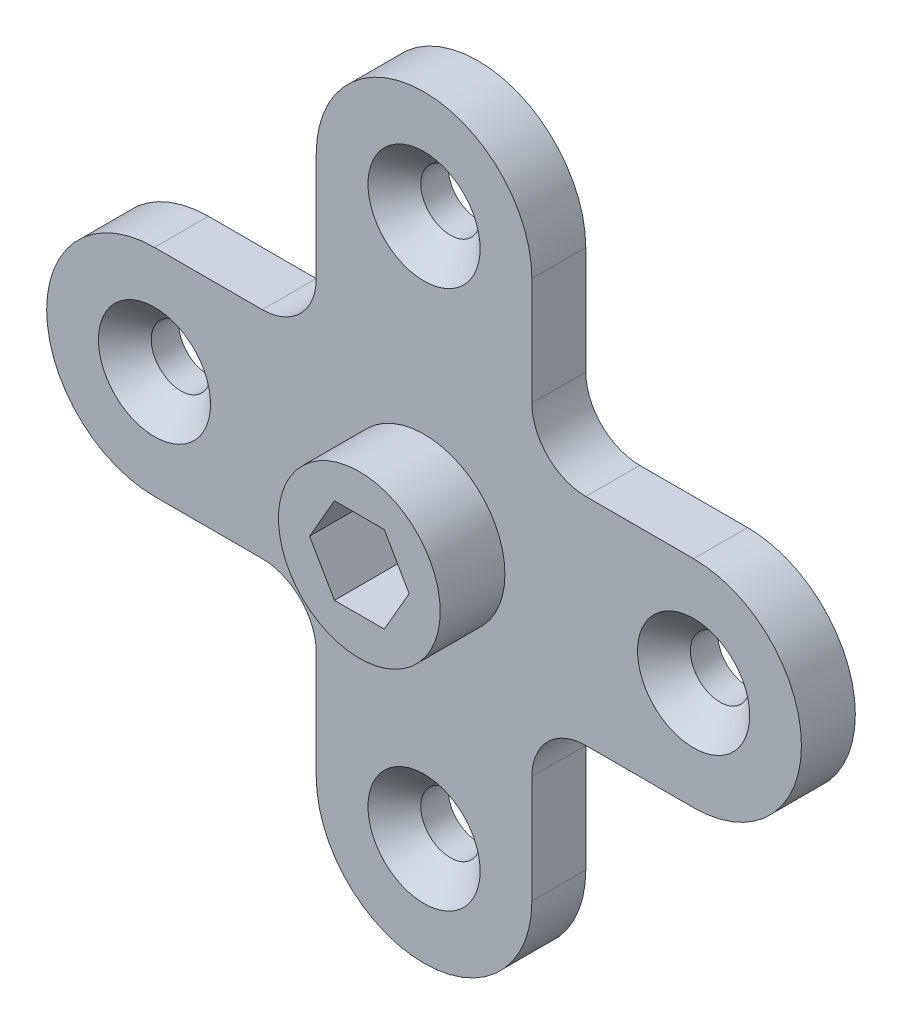
ISO-10303-21;
HEADER;
FILE_DESCRIPTION(('STEP AP214'),'2;1');
FILE_NAME('part.step','',(''),(''),'','','');
FILE_SCHEMA(('AUTOMOTIVE_DESIGN { 1 0 10303 214 1 1 1 1 }'));
ENDSEC;
DATA;
#1=APPLICATION_CONTEXT('core data for automotive mechanical design processes');
#2=APPLICATION_PROTOCOL_DEFINITION('international standard','automotive_design',2000,#1);
#3=PRODUCT_CONTEXT('',#1,'mechanical');
#4=PRODUCT('Part','Part','',(#3));
#5=PRODUCT_RELATED_PRODUCT_CATEGORY('part','',(#4));
#6=PRODUCT_DEFINITION_FORMATION('','',#4);
#7=PRODUCT_DEFINITION_CONTEXT('part definition',#1,'design');
#8=PRODUCT_DEFINITION('design','',#6,#7);
#9=PRODUCT_DEFINITION_SHAPE('','',#8);
#10=(LENGTH_UNIT() NAMED_UNIT(*) SI_UNIT(.MILLI.,.METRE.));
#11=(NAMED_UNIT(*) PLANE_ANGLE_UNIT() SI_UNIT($,.RADIAN.));
#12=(NAMED_UNIT(*) SI_UNIT($,.STERADIAN.) SOLID_ANGLE_UNIT());
#13=UNCERTAINTY_MEASURE_WITH_UNIT(LENGTH_MEASURE(1.E-05),#10,'distance_accuracy_value','');
#14=(GEOMETRIC_REPRESENTATION_CONTEXT(3) GLOBAL_UNCERTAINTY_ASSIGNED_CONTEXT((#13)) GLOBAL_UNIT_ASSIGNED_CONTEXT((#10,
#11,#12)) REPRESENTATION_CONTEXT('',''));
#15=CARTESIAN_POINT('',(0.,0.,0.));
#16=DIRECTION('',(0.,0.,1.));
#17=DIRECTION('',(1.,0.,0.));
#18=AXIS2_PLACEMENT_3D('',#15,#16,#17);
#19=CARTESIAN_POINT('',(0.,25.,2.5));
#20=DIRECTION('',(0.,0.,1.));
#21=DIRECTION('',(1.,0.,0.));
#22=AXIS2_PLACEMENT_3D('',#19,#20,#21);
#23=PLANE('',#22);
#24=CARTESIAN_POINT('',(0.,25.,2.5));
#25=DIRECTION('',(0.,0.,1.));
#26=DIRECTION('',(1.,0.,0.));
#27=AXIS2_PLACEMENT_3D('',#24,#25,#26);
#28=CIRCLE('',#27,10.);
#29=CARTESIAN_POINT('',(9.99999999999999,25.,2.5));
#30=VERTEX_POINT('',#29);
#31=CARTESIAN_POINT('',(-10.,25.,2.5));
#32=VERTEX_POINT('',#31);
#33=EDGE_CURVE('E283',#30,#32,#28,.T.);
#34=ORIENTED_EDGE('',*,*,#33,.T.);
#35=DIRECTION('',(0.,-1.,0.));
#36=VECTOR('',#35,1.);
#37=CARTESIAN_POINT('',(-10.,25.,2.5));
#38=LINE('',#37,#36);
#39=CARTESIAN_POINT('',(-10.,15.,2.5));
#40=VERTEX_POINT('',#39);
#41=EDGE_CURVE('E286',#32,#40,#38,.T.);
#42=ORIENTED_EDGE('',*,*,#41,.T.);
#43=CARTESIAN_POINT('',(-15.,15.,2.5));
#44=DIRECTION('',(0.,0.,1.));
#45=DIRECTION('',(1.,0.,0.));
#46=AXIS2_PLACEMENT_3D('',#43,#44,#45);
#47=CIRCLE('',#46,5.);
#48=CARTESIAN_POINT('',(-15.,10.,2.5));
#49=VERTEX_POINT('',#48);
#50=EDGE_CURVE('E390',#40,#49,#47,.F.);
#51=ORIENTED_EDGE('',*,*,#50,.T.);
#52=DIRECTION('',(-1.,0.,0.));
#53=VECTOR('',#52,1.);
#54=CARTESIAN_POINT('',(-25.,10.,2.5));
#55=LINE('',#54,#53);
#56=CARTESIAN_POINT('',(-25.,10.,2.5));
#57=VERTEX_POINT('',#56);
#58=EDGE_CURVE('E290',#49,#57,#55,.T.);
#59=ORIENTED_EDGE('',*,*,#58,.T.);
#60=CARTESIAN_POINT('',(-25.,0.,2.5));
#61=DIRECTION('',(0.,0.,1.));
#62=DIRECTION('',(1.,0.,0.));
#63=AXIS2_PLACEMENT_3D('',#60,#61,#62);
#64=CIRCLE('',#63,10.);
#65=CARTESIAN_POINT('',(-25.,-10.,2.5));
#66=VERTEX_POINT('',#65);
#67=EDGE_CURVE('E292',#57,#66,#64,.T.);
#68=ORIENTED_EDGE('',*,*,#67,.T.);
#69=DIRECTION('',(1.,0.,0.));
#70=VECTOR('',#69,1.);
#71=CARTESIAN_POINT('',(-25.,-10.,2.5));
#72=LINE('',#71,#70);
#73=CARTESIAN_POINT('',(-15.,-10.,2.5));
#74=VERTEX_POINT('',#73);
#75=EDGE_CURVE('E294',#66,#74,#72,.T.);
#76=ORIENTED_EDGE('',*,*,#75,.T.);
#77=CARTESIAN_POINT('',(-15.,-15.,2.5));
#78=DIRECTION('',(0.,0.,1.));
#79=DIRECTION('',(1.,0.,0.));
#80=AXIS2_PLACEMENT_3D('',#77,#78,#79);
#81=CIRCLE('',#80,5.);
#82=CARTESIAN_POINT('',(-9.99999999999999,-15.,2.5));
#83=VERTEX_POINT('',#82);
#84=EDGE_CURVE('E386',#74,#83,#81,.F.);
#85=ORIENTED_EDGE('',*,*,#84,.T.);
#86=DIRECTION('',(0.,-1.,0.));
#87=VECTOR('',#86,1.);
#88=CARTESIAN_POINT('',(-9.99999999999999,-10.,2.5));
#89=LINE('',#88,#87);
#90=CARTESIAN_POINT('',(-9.99999999999999,-25.,2.5));
#91=VERTEX_POINT('',#90);
#92=EDGE_CURVE('E297',#83,#91,#89,.T.);
#93=ORIENTED_EDGE('',*,*,#92,.T.);
#94=CARTESIAN_POINT('',(0.,-25.,2.5));
#95=DIRECTION('',(0.,0.,1.));
#96=DIRECTION('',(1.,0.,0.));
#97=AXIS2_PLACEMENT_3D('',#94,#95,#96);
#98=CIRCLE('',#97,10.);
#99=CARTESIAN_POINT('',(10.,-25.,2.5));
#100=VERTEX_POINT('',#99);
#101=EDGE_CURVE('E299',#91,#100,#98,.T.);
#102=ORIENTED_EDGE('',*,*,#101,.T.);
#103=DIRECTION('',(0.,1.,0.));
#104=VECTOR('',#103,1.);
#105=CARTESIAN_POINT('',(10.,-10.,2.5));
#106=LINE('',#105,#104);
#107=CARTESIAN_POINT('',(10.,-15.,2.5));
#108=VERTEX_POINT('',#107);
#109=EDGE_CURVE('E301',#100,#108,#106,.T.);
#110=ORIENTED_EDGE('',*,*,#109,.T.);
#111=CARTESIAN_POINT('',(15.,-15.,2.5));
#112=DIRECTION('',(0.,0.,1.));
#113=DIRECTION('',(1.,0.,0.));
#114=AXIS2_PLACEMENT_3D('',#111,#112,#113);
#115=CIRCLE('',#114,5.);
#116=CARTESIAN_POINT('',(15.,-10.,2.5));
#117=VERTEX_POINT('',#116);
#118=EDGE_CURVE('E11',#108,#117,#115,.F.);
#119=ORIENTED_EDGE('',*,*,#118,.T.);
#120=DIRECTION('',(1.,0.,0.));
#121=VECTOR('',#120,1.);
#122=CARTESIAN_POINT('',(10.,-10.,2.5));
#123=LINE('',#122,#121);
#124=CARTESIAN_POINT('',(25.,-10.,2.5));
#125=VERTEX_POINT('',#124);
#126=EDGE_CURVE('E304',#117,#125,#123,.T.);
#127=ORIENTED_EDGE('',*,*,#126,.T.);
#128=CARTESIAN_POINT('',(25.,0.,2.5));
#129=DIRECTION('',(0.,0.,1.));
#130=DIRECTION('',(1.,0.,0.));
#131=AXIS2_PLACEMENT_3D('',#128,#129,#130);
#132=CIRCLE('',#131,10.);
#133=CARTESIAN_POINT('',(25.,10.,2.5));
#134=VERTEX_POINT('',#133);
#135=EDGE_CURVE('E306',#125,#134,#132,.T.);
#136=ORIENTED_EDGE('',*,*,#135,.T.);
#137=DIRECTION('',(-1.,0.,0.));
#138=VECTOR('',#137,1.);
#139=CARTESIAN_POINT('',(9.99999999999999,10.,2.5));
#140=LINE('',#139,#138);
#141=CARTESIAN_POINT('',(15.,10.,2.5));
#142=VERTEX_POINT('',#141);
#143=EDGE_CURVE('E308',#134,#142,#140,.T.);
#144=ORIENTED_EDGE('',*,*,#143,.T.);
#145=CARTESIAN_POINT('',(15.,15.,2.5));
#146=DIRECTION('',(0.,0.,1.));
#147=DIRECTION('',(1.,0.,0.));
#148=AXIS2_PLACEMENT_3D('',#145,#146,#147);
#149=CIRCLE('',#148,5.);
#150=CARTESIAN_POINT('',(9.99999999999999,15.,2.5));
#151=VERTEX_POINT('',#150);
#152=EDGE_CURVE('E394',#142,#151,#149,.F.);
#153=ORIENTED_EDGE('',*,*,#152,.T.);
#154=DIRECTION('',(0.,1.,0.));
#155=VECTOR('',#154,1.);
#156=CARTESIAN_POINT('',(9.99999999999999,25.,2.5));
#157=LINE('',#156,#155);
#158=EDGE_CURVE('E311',#151,#30,#157,.T.);
#159=ORIENTED_EDGE('',*,*,#158,.T.);
#160=EDGE_LOOP('',(#34,#42,#51,#59,#68,#76,#85,#93,#102,#110,#119,#127,#136,#144,#153,#159));
#161=FACE_BOUND('',#160,.T.);
#162=CARTESIAN_POINT('',(-25.,0.,2.5));
#163=DIRECTION('',(0.,0.,1.));
#164=DIRECTION('',(1.,0.,0.));
#165=AXIS2_PLACEMENT_3D('',#162,#163,#164);
#166=CIRCLE('',#165,5.2);
#167=CARTESIAN_POINT('',(-19.8,0.,2.5));
#168=VERTEX_POINT('',#167);
#169=EDGE_CURVE('E273',#168,#168,#166,.T.);
#170=ORIENTED_EDGE('',*,*,#169,.F.);
#171=EDGE_LOOP('',(#170));
#172=FACE_BOUND('',#171,.T.);
#173=CARTESIAN_POINT('',(25.,0.,2.5));
#174=DIRECTION('',(0.,0.,1.));
#175=DIRECTION('',(1.,0.,0.));
#176=AXIS2_PLACEMENT_3D('',#173,#174,#175);
#177=CIRCLE('',#176,5.2);
#178=CARTESIAN_POINT('',(30.2,0.,2.5));
#179=VERTEX_POINT('',#178);
#180=EDGE_CURVE('E264',#179,#179,#177,.T.);
#181=ORIENTED_EDGE('',*,*,#180,.F.);
#182=EDGE_LOOP('',(#181));
#183=FACE_BOUND('',#182,.T.);
#184=CARTESIAN_POINT('',(0.,-25.,2.5));
#185=DIRECTION('',(0.,0.,1.));
#186=DIRECTION('',(1.,0.,0.));
#187=AXIS2_PLACEMENT_3D('',#184,#185,#186);
#188=CIRCLE('',#187,5.2);
#189=CARTESIAN_POINT('',(5.20000000000001,-25.,2.5));
#190=VERTEX_POINT('',#189);
#191=EDGE_CURVE('E255',#190,#190,#188,.T.);
#192=ORIENTED_EDGE('',*,*,#191,.F.);
#193=EDGE_LOOP('',(#192));
#194=FACE_BOUND('',#193,.T.);
#195=CARTESIAN_POINT('',(0.,25.,2.5));
#196=DIRECTION('',(0.,0.,1.));
#197=DIRECTION('',(1.,0.,0.));
#198=AXIS2_PLACEMENT_3D('',#195,#196,#197);
#199=CIRCLE('',#198,5.2);
#200=CARTESIAN_POINT('',(5.19999999999999,25.,2.5));
#201=VERTEX_POINT('',#200);
#202=EDGE_CURVE('E246',#201,#201,#199,.T.);
#203=ORIENTED_EDGE('',*,*,#202,.F.);
#204=EDGE_LOOP('',(#203));
#205=FACE_BOUND('',#204,.T.);
#206=CARTESIAN_POINT('',(0.,0.,2.5));
#207=DIRECTION('',(0.,0.,1.));
#208=DIRECTION('',(1.,0.,0.));
#209=AXIS2_PLACEMENT_3D('',#206,#207,#208);
#210=CIRCLE('',#209,7.5);
#211=CARTESIAN_POINT('',(7.5,0.,2.5));
#212=VERTEX_POINT('',#211);
#213=EDGE_CURVE('E195',#212,#212,#210,.T.);
#214=ORIENTED_EDGE('',*,*,#213,.F.);
#215=EDGE_LOOP('',(#214));
#216=FACE_BOUND('',#215,.T.);
#217=ADVANCED_FACE('F33',(#161,#172,#183,#194,#205,#216),#23,.T.);
#218=DIRECTION('',(-0.5,0.866025403784438,0.));
#219=VECTOR('',#218,1.);
#220=CARTESIAN_POINT('',(4.618802153517,0.,2.5));
#221=LINE('',#220,#219);
#222=CARTESIAN_POINT('',(4.618802153517,0.,2.5));
#223=VERTEX_POINT('',#222);
#224=CARTESIAN_POINT('',(2.3094010767585,4.,2.5));
#225=VERTEX_POINT('',#224);
#226=EDGE_CURVE('E48',#223,#225,#221,.T.);
#227=ORIENTED_EDGE('',*,*,#226,.T.);
#228=DIRECTION('',(-1.,0.,0.));
#229=VECTOR('',#228,1.);
#230=CARTESIAN_POINT('',(2.3094010767585,4.,2.5));
#231=LINE('',#230,#229);
#232=CARTESIAN_POINT('',(-2.3094010767585,4.,2.5));
#233=VERTEX_POINT('',#232);
#234=EDGE_CURVE('E52',#225,#233,#231,.T.);
#235=ORIENTED_EDGE('',*,*,#234,.T.);
#236=DIRECTION('',(-0.5,-0.866025403784439,0.));
#237=VECTOR('',#236,1.);
#238=CARTESIAN_POINT('',(-2.3094010767585,4.,2.5));
#239=LINE('',#238,#237);
#240=CARTESIAN_POINT('',(-4.61880215351701,0.,2.5));
#241=VERTEX_POINT('',#240);
#242=EDGE_CURVE('E214',#233,#241,#239,.T.);
#243=ORIENTED_EDGE('',*,*,#242,.T.);
#244=DIRECTION('',(0.5,-0.866025403784439,0.));
#245=VECTOR('',#244,1.);
#246=CARTESIAN_POINT('',(-4.61880215351701,0.,2.5));
#247=LINE('',#246,#245);
#248=CARTESIAN_POINT('',(-2.3094010767585,-4.,2.5));
#249=VERTEX_POINT('',#248);
#250=EDGE_CURVE('E216',#241,#249,#247,.T.);
#251=ORIENTED_EDGE('',*,*,#250,.T.);
#252=DIRECTION('',(1.,0.,0.));
#253=VECTOR('',#252,1.);
#254=CARTESIAN_POINT('',(-2.3094010767585,-4.,2.5));
#255=LINE('',#254,#253);
#256=CARTESIAN_POINT('',(2.3094010767585,-4.,2.5));
#257=VERTEX_POINT('',#256);
#258=EDGE_CURVE('E218',#249,#257,#255,.T.);
#259=ORIENTED_EDGE('',*,*,#258,.T.);
#260=DIRECTION('',(0.5,0.866025403784439,0.));
#261=VECTOR('',#260,1.);
#262=CARTESIAN_POINT('',(2.3094010767585,-4.,2.5));
#263=LINE('',#262,#261);
#264=EDGE_CURVE('E190',#257,#223,#263,.T.);
#265=ORIENTED_EDGE('',*,*,#264,.T.);
#266=EDGE_LOOP('',(#227,#235,#243,#251,#259,#265));
#267=FACE_BOUND('',#266,.T.);
#268=CARTESIAN_POINT('',(0.,0.,2.5));
#269=DIRECTION('',(0.,0.,-1.));
#270=DIRECTION('',(-1.,0.,0.));
#271=AXIS2_PLACEMENT_3D('',#268,#269,#270);
#272=CIRCLE('',#271,2.74999999999999);
#273=CARTESIAN_POINT('',(-2.74999999999999,0.,2.5));
#274=VERTEX_POINT('',#273);
#275=EDGE_CURVE('E243',#274,#274,#272,.T.);
#276=ORIENTED_EDGE('',*,*,#275,.T.);
#277=EDGE_LOOP('',(#276));
#278=FACE_BOUND('',#277,.T.);
#279=ADVANCED_FACE('F480',(#267,#278),#23,.T.);
#280=CARTESIAN_POINT('',(0.,25.,-2.5));
#281=DIRECTION('',(0.,0.,1.));
#282=DIRECTION('',(1.,0.,0.));
#283=AXIS2_PLACEMENT_3D('',#280,#281,#282);
#284=PLANE('',#283);
#285=CARTESIAN_POINT('',(0.,25.,-2.5));
#286=DIRECTION('',(0.,0.,1.));
#287=DIRECTION('',(1.,0.,0.));
#288=AXIS2_PLACEMENT_3D('',#285,#286,#287);
#289=CIRCLE('',#288,2.75);
#290=CARTESIAN_POINT('',(2.74999999999999,25.,-2.5));
#291=VERTEX_POINT('',#290);
#292=EDGE_CURVE('E252',#291,#291,#289,.T.);
#293=ORIENTED_EDGE('',*,*,#292,.T.);
#294=EDGE_LOOP('',(#293));
#295=FACE_BOUND('',#294,.T.);
#296=CARTESIAN_POINT('',(0.,-25.,-2.5));
#297=DIRECTION('',(0.,0.,1.));
#298=DIRECTION('',(1.,0.,0.));
#299=AXIS2_PLACEMENT_3D('',#296,#297,#298);
#300=CIRCLE('',#299,2.75);
#301=CARTESIAN_POINT('',(2.75000000000001,-25.,-2.5));
#302=VERTEX_POINT('',#301);
#303=EDGE_CURVE('E261',#302,#302,#300,.T.);
#304=ORIENTED_EDGE('',*,*,#303,.T.);
#305=EDGE_LOOP('',(#304));
#306=FACE_BOUND('',#305,.T.);
#307=CARTESIAN_POINT('',(25.,0.,-2.5));
#308=DIRECTION('',(0.,0.,1.));
#309=DIRECTION('',(1.,0.,0.));
#310=AXIS2_PLACEMENT_3D('',#307,#308,#309);
#311=CIRCLE('',#310,2.75);
#312=CARTESIAN_POINT('',(27.75,0.,-2.5));
#313=VERTEX_POINT('',#312);
#314=EDGE_CURVE('E270',#313,#313,#311,.T.);
#315=ORIENTED_EDGE('',*,*,#314,.T.);
#316=EDGE_LOOP('',(#315));
#317=FACE_BOUND('',#316,.T.);
#318=CARTESIAN_POINT('',(-25.,0.,-2.5));
#319=DIRECTION('',(0.,0.,1.));
#320=DIRECTION('',(1.,0.,0.));
#321=AXIS2_PLACEMENT_3D('',#318,#319,#320);
#322=CIRCLE('',#321,2.75);
#323=CARTESIAN_POINT('',(-22.25,0.,-2.5));
#324=VERTEX_POINT('',#323);
#325=EDGE_CURVE('E279',#324,#324,#322,.T.);
#326=ORIENTED_EDGE('',*,*,#325,.T.);
#327=EDGE_LOOP('',(#326));
#328=FACE_BOUND('',#327,.T.);
#329=CARTESIAN_POINT('',(0.,25.,-2.5));
#330=DIRECTION('',(0.,0.,1.));
#331=DIRECTION('',(1.,0.,0.));
#332=AXIS2_PLACEMENT_3D('',#329,#330,#331);
#333=CIRCLE('',#332,10.);
#334=CARTESIAN_POINT('',(9.99999999999999,25.,-2.5));
#335=VERTEX_POINT('',#334);
#336=CARTESIAN_POINT('',(-10.,25.,-2.5));
#337=VERTEX_POINT('',#336);
#338=EDGE_CURVE('E282',#335,#337,#333,.T.);
#339=ORIENTED_EDGE('',*,*,#338,.F.);
#340=DIRECTION('',(0.,1.,0.));
#341=VECTOR('',#340,1.);
#342=CARTESIAN_POINT('',(9.99999999999999,25.,-2.5));
#343=LINE('',#342,#341);
#344=CARTESIAN_POINT('',(9.99999999999999,15.,-2.5));
#345=VERTEX_POINT('',#344);
#346=EDGE_CURVE('E287',#345,#335,#343,.T.);
#347=ORIENTED_EDGE('',*,*,#346,.F.);
#348=CARTESIAN_POINT('',(15.,15.,-2.5));
#349=DIRECTION('',(0.,0.,1.));
#350=DIRECTION('',(1.,0.,0.));
#351=AXIS2_PLACEMENT_3D('',#348,#349,#350);
#352=CIRCLE('',#351,5.);
#353=CARTESIAN_POINT('',(15.,10.,-2.5));
#354=VERTEX_POINT('',#353);
#355=EDGE_CURVE('E392',#345,#354,#352,.T.);
#356=ORIENTED_EDGE('',*,*,#355,.T.);
#357=DIRECTION('',(-1.,0.,0.));
#358=VECTOR('',#357,1.);
#359=CARTESIAN_POINT('',(9.99999999999999,10.,-2.5));
#360=LINE('',#359,#358);
#361=CARTESIAN_POINT('',(25.,10.,-2.5));
#362=VERTEX_POINT('',#361);
#363=EDGE_CURVE('E337',#362,#354,#360,.T.);
#364=ORIENTED_EDGE('',*,*,#363,.F.);
#365=CARTESIAN_POINT('',(25.,0.,-2.5));
#366=DIRECTION('',(0.,0.,1.));
#367=DIRECTION('',(1.,0.,0.));
#368=AXIS2_PLACEMENT_3D('',#365,#366,#367);
#369=CIRCLE('',#368,10.);
#370=CARTESIAN_POINT('',(25.,-10.,-2.5));
#371=VERTEX_POINT('',#370);
#372=EDGE_CURVE('E335',#371,#362,#369,.T.);
#373=ORIENTED_EDGE('',*,*,#372,.F.);
#374=DIRECTION('',(1.,0.,0.));
#375=VECTOR('',#374,1.);
#376=CARTESIAN_POINT('',(10.,-10.,-2.5));
#377=LINE('',#376,#375);
#378=CARTESIAN_POINT('',(15.,-10.,-2.5));
#379=VERTEX_POINT('',#378);
#380=EDGE_CURVE('E333',#379,#371,#377,.T.);
#381=ORIENTED_EDGE('',*,*,#380,.F.);
#382=CARTESIAN_POINT('',(15.,-15.,-2.5));
#383=DIRECTION('',(0.,0.,1.));
#384=DIRECTION('',(1.,0.,0.));
#385=AXIS2_PLACEMENT_3D('',#382,#383,#384);
#386=CIRCLE('',#385,5.);
#387=CARTESIAN_POINT('',(10.,-15.,-2.5));
#388=VERTEX_POINT('',#387);
#389=EDGE_CURVE('E41',#379,#388,#386,.T.);
#390=ORIENTED_EDGE('',*,*,#389,.T.);
#391=DIRECTION('',(0.,1.,0.));
#392=VECTOR('',#391,1.);
#393=CARTESIAN_POINT('',(10.,-10.,-2.5));
#394=LINE('',#393,#392);
#395=CARTESIAN_POINT('',(10.,-25.,-2.5));
#396=VERTEX_POINT('',#395);
#397=EDGE_CURVE('E330',#396,#388,#394,.T.);
#398=ORIENTED_EDGE('',*,*,#397,.F.);
#399=CARTESIAN_POINT('',(0.,-25.,-2.5));
#400=DIRECTION('',(0.,0.,1.));
#401=DIRECTION('',(1.,0.,0.));
#402=AXIS2_PLACEMENT_3D('',#399,#400,#401);
#403=CIRCLE('',#402,10.);
#404=CARTESIAN_POINT('',(-9.99999999999999,-25.,-2.5));
#405=VERTEX_POINT('',#404);
#406=EDGE_CURVE('E328',#405,#396,#403,.T.);
#407=ORIENTED_EDGE('',*,*,#406,.F.);
#408=DIRECTION('',(0.,-1.,0.));
#409=VECTOR('',#408,1.);
#410=CARTESIAN_POINT('',(-9.99999999999999,-10.,-2.5));
#411=LINE('',#410,#409);
#412=CARTESIAN_POINT('',(-9.99999999999999,-15.,-2.5));
#413=VERTEX_POINT('',#412);
#414=EDGE_CURVE('E326',#413,#405,#411,.T.);
#415=ORIENTED_EDGE('',*,*,#414,.F.);
#416=CARTESIAN_POINT('',(-15.,-15.,-2.5));
#417=DIRECTION('',(0.,0.,1.));
#418=DIRECTION('',(1.,0.,0.));
#419=AXIS2_PLACEMENT_3D('',#416,#417,#418);
#420=CIRCLE('',#419,5.);
#421=CARTESIAN_POINT('',(-15.,-10.,-2.5));
#422=VERTEX_POINT('',#421);
#423=EDGE_CURVE('E384',#413,#422,#420,.T.);
#424=ORIENTED_EDGE('',*,*,#423,.T.);
#425=DIRECTION('',(1.,0.,0.));
#426=VECTOR('',#425,1.);
#427=CARTESIAN_POINT('',(-25.,-10.,-2.5));
#428=LINE('',#427,#426);
#429=CARTESIAN_POINT('',(-25.,-10.,-2.5));
#430=VERTEX_POINT('',#429);
#431=EDGE_CURVE('E323',#430,#422,#428,.T.);
#432=ORIENTED_EDGE('',*,*,#431,.F.);
#433=CARTESIAN_POINT('',(-25.,0.,-2.5));
#434=DIRECTION('',(0.,0.,1.));
#435=DIRECTION('',(1.,0.,0.));
#436=AXIS2_PLACEMENT_3D('',#433,#434,#435);
#437=CIRCLE('',#436,10.);
#438=CARTESIAN_POINT('',(-25.,10.,-2.5));
#439=VERTEX_POINT('',#438);
#440=EDGE_CURVE('E321',#439,#430,#437,.T.);
#441=ORIENTED_EDGE('',*,*,#440,.F.);
#442=DIRECTION('',(-1.,0.,0.));
#443=VECTOR('',#442,1.);
#444=CARTESIAN_POINT('',(-25.,10.,-2.5));
#445=LINE('',#444,#443);
#446=CARTESIAN_POINT('',(-15.,10.,-2.5));
#447=VERTEX_POINT('',#446);
#448=EDGE_CURVE('E319',#447,#439,#445,.T.);
#449=ORIENTED_EDGE('',*,*,#448,.F.);
#450=CARTESIAN_POINT('',(-15.,15.,-2.5));
#451=DIRECTION('',(0.,0.,1.));
#452=DIRECTION('',(1.,0.,0.));
#453=AXIS2_PLACEMENT_3D('',#450,#451,#452);
#454=CIRCLE('',#453,5.);
#455=CARTESIAN_POINT('',(-10.,15.,-2.5));
#456=VERTEX_POINT('',#455);
#457=EDGE_CURVE('E388',#447,#456,#454,.T.);
#458=ORIENTED_EDGE('',*,*,#457,.T.);
#459=DIRECTION('',(0.,-1.,0.));
#460=VECTOR('',#459,1.);
#461=CARTESIAN_POINT('',(-10.,25.,-2.5));
#462=LINE('',#461,#460);
#463=EDGE_CURVE('E316',#337,#456,#462,.T.);
#464=ORIENTED_EDGE('',*,*,#463,.F.);
#465=EDGE_LOOP('',(#339,#347,#356,#364,#373,#381,#390,#398,#407,#415,#424,#432,#441,#449,#458,#464));
#466=FACE_BOUND('',#465,.T.);
#467=CARTESIAN_POINT('',(0.,0.,-2.5));
#468=DIRECTION('',(0.,0.,-1.));
#469=DIRECTION('',(-1.,0.,0.));
#470=AXIS2_PLACEMENT_3D('',#467,#468,#469);
#471=CIRCLE('',#470,5.2);
#472=CARTESIAN_POINT('',(-5.2,0.,-2.5));
#473=VERTEX_POINT('',#472);
#474=EDGE_CURVE('E235',#473,#473,#471,.T.);
#475=ORIENTED_EDGE('',*,*,#474,.F.);
#476=EDGE_LOOP('',(#475));
#477=FACE_BOUND('',#476,.T.);
#478=ADVANCED_FACE('F399',(#295,#306,#317,#328,#466,#477),#284,.F.);
#479=CARTESIAN_POINT('',(0.,25.,2.5));
#480=DIRECTION('',(0.,0.,-1.));
#481=DIRECTION('',(-1.,0.,0.));
#482=AXIS2_PLACEMENT_3D('',#479,#480,#481);
#483=CYLINDRICAL_SURFACE('',#482,10.);
#484=ORIENTED_EDGE('',*,*,#338,.T.);
#485=DIRECTION('',(0.,0.,-1.));
#486=VECTOR('',#485,1.);
#487=CARTESIAN_POINT('',(-10.,25.,2.5));
#488=LINE('',#487,#486);
#489=EDGE_CURVE('E361',#32,#337,#488,.T.);
#490=ORIENTED_EDGE('',*,*,#489,.F.);
#491=ORIENTED_EDGE('',*,*,#33,.F.);
#492=DIRECTION('',(0.,0.,-1.));
#493=VECTOR('',#492,1.);
#494=CARTESIAN_POINT('',(9.99999999999999,25.,2.5));
#495=LINE('',#494,#493);
#496=EDGE_CURVE('E313',#30,#335,#495,.T.);
#497=ORIENTED_EDGE('',*,*,#496,.T.);
#498=EDGE_LOOP('',(#484,#490,#491,#497));
#499=FACE_BOUND('',#498,.T.);
#500=ADVANCED_FACE('F436',(#499),#483,.T.);
#501=CARTESIAN_POINT('',(-10.,25.,2.5));
#502=DIRECTION('',(1.,0.,0.));
#503=DIRECTION('',(0.,1.,0.));
#504=AXIS2_PLACEMENT_3D('',#501,#502,#503);
#505=PLANE('',#504);
#506=ORIENTED_EDGE('',*,*,#463,.T.);
#507=DIRECTION('',(0.,0.,-1.));
#508=VECTOR('',#507,1.);
#509=CARTESIAN_POINT('',(-10.,15.,2.5));
#510=LINE('',#509,#508);
#511=EDGE_CURVE('E372',#456,#40,#510,.F.);
#512=ORIENTED_EDGE('',*,*,#511,.T.);
#513=ORIENTED_EDGE('',*,*,#41,.F.);
#514=ORIENTED_EDGE('',*,*,#489,.T.);
#515=EDGE_LOOP('',(#506,#512,#513,#514));
#516=FACE_BOUND('',#515,.T.);
#517=ADVANCED_FACE('F728',(#516),#505,.F.);
#518=CARTESIAN_POINT('',(-25.,10.,2.5));
#519=DIRECTION('',(0.,-1.,0.));
#520=DIRECTION('',(1.,0.,0.));
#521=AXIS2_PLACEMENT_3D('',#518,#519,#520);
#522=PLANE('',#521);
#523=ORIENTED_EDGE('',*,*,#58,.F.);
#524=DIRECTION('',(0.,0.,-1.));
#525=VECTOR('',#524,1.);
#526=CARTESIAN_POINT('',(-15.,10.,-2.5));
#527=LINE('',#526,#525);
#528=EDGE_CURVE('E369',#49,#447,#527,.T.);
#529=ORIENTED_EDGE('',*,*,#528,.T.);
#530=ORIENTED_EDGE('',*,*,#448,.T.);
#531=DIRECTION('',(0.,0.,-1.));
#532=VECTOR('',#531,1.);
#533=CARTESIAN_POINT('',(-25.,10.,2.5));
#534=LINE('',#533,#532);
#535=EDGE_CURVE('E358',#57,#439,#534,.T.);
#536=ORIENTED_EDGE('',*,*,#535,.F.);
#537=EDGE_LOOP('',(#523,#529,#530,#536));
#538=FACE_BOUND('',#537,.T.);
#539=ADVANCED_FACE('F447',(#538),#522,.F.);
#540=CARTESIAN_POINT('',(-25.,0.,2.5));
#541=DIRECTION('',(0.,0.,-1.));
#542=DIRECTION('',(-1.,0.,0.));
#543=AXIS2_PLACEMENT_3D('',#540,#541,#542);
#544=CYLINDRICAL_SURFACE('',#543,10.);
#545=ORIENTED_EDGE('',*,*,#440,.T.);
#546=DIRECTION('',(0.,0.,-1.));
#547=VECTOR('',#546,1.);
#548=CARTESIAN_POINT('',(-25.,-10.,2.5));
#549=LINE('',#548,#547);
#550=EDGE_CURVE('E355',#66,#430,#549,.T.);
#551=ORIENTED_EDGE('',*,*,#550,.F.);
#552=ORIENTED_EDGE('',*,*,#67,.F.);
#553=ORIENTED_EDGE('',*,*,#535,.T.);
#554=EDGE_LOOP('',(#545,#551,#552,#553));
#555=FACE_BOUND('',#554,.T.);
#556=ADVANCED_FACE('F453',(#555),#544,.T.);
#557=CARTESIAN_POINT('',(-25.,-10.,2.5));
#558=DIRECTION('',(0.,1.,0.));
#559=DIRECTION('',(-1.,0.,0.));
#560=AXIS2_PLACEMENT_3D('',#557,#558,#559);
#561=PLANE('',#560);
#562=ORIENTED_EDGE('',*,*,#431,.T.);
#563=DIRECTION('',(0.,0.,-1.));
#564=VECTOR('',#563,1.);
#565=CARTESIAN_POINT('',(-15.,-10.,2.5));
#566=LINE('',#565,#564);
#567=EDGE_CURVE('E367',#422,#74,#566,.F.);
#568=ORIENTED_EDGE('',*,*,#567,.T.);
#569=ORIENTED_EDGE('',*,*,#75,.F.);
#570=ORIENTED_EDGE('',*,*,#550,.T.);
#571=EDGE_LOOP('',(#562,#568,#569,#570));
#572=FACE_BOUND('',#571,.T.);
#573=ADVANCED_FACE('F457',(#572),#561,.F.);
#574=CARTESIAN_POINT('',(-9.99999999999999,-10.,2.5));
#575=DIRECTION('',(1.,0.,0.));
#576=DIRECTION('',(0.,1.,0.));
#577=AXIS2_PLACEMENT_3D('',#574,#575,#576);
#578=PLANE('',#577);
#579=ORIENTED_EDGE('',*,*,#92,.F.);
#580=DIRECTION('',(0.,0.,-1.));
#581=VECTOR('',#580,1.);
#582=CARTESIAN_POINT('',(-9.99999999999999,-15.,-2.5));
#583=LINE('',#582,#581);
#584=EDGE_CURVE('E364',#83,#413,#583,.T.);
#585=ORIENTED_EDGE('',*,*,#584,.T.);
#586=ORIENTED_EDGE('',*,*,#414,.T.);
#587=DIRECTION('',(0.,0.,-1.));
#588=VECTOR('',#587,1.);
#589=CARTESIAN_POINT('',(-9.99999999999999,-25.,2.5));
#590=LINE('',#589,#588);
#591=EDGE_CURVE('E352',#91,#405,#590,.T.);
#592=ORIENTED_EDGE('',*,*,#591,.F.);
#593=EDGE_LOOP('',(#579,#585,#586,#592));
#594=FACE_BOUND('',#593,.T.);
#595=ADVANCED_FACE('F466',(#594),#578,.F.);
#596=CARTESIAN_POINT('',(0.,-25.,2.5));
#597=DIRECTION('',(0.,0.,-1.));
#598=DIRECTION('',(-1.,0.,0.));
#599=AXIS2_PLACEMENT_3D('',#596,#597,#598);
#600=CYLINDRICAL_SURFACE('',#599,10.);
#601=ORIENTED_EDGE('',*,*,#406,.T.);
#602=DIRECTION('',(0.,0.,-1.));
#603=VECTOR('',#602,1.);
#604=CARTESIAN_POINT('',(10.,-25.,2.5));
#605=LINE('',#604,#603);
#606=EDGE_CURVE('E349',#100,#396,#605,.T.);
#607=ORIENTED_EDGE('',*,*,#606,.F.);
#608=ORIENTED_EDGE('',*,*,#101,.F.);
#609=ORIENTED_EDGE('',*,*,#591,.T.);
#610=EDGE_LOOP('',(#601,#607,#608,#609));
#611=FACE_BOUND('',#610,.T.);
#612=ADVANCED_FACE('F469',(#611),#600,.T.);
#613=CARTESIAN_POINT('',(10.,-10.,2.5));
#614=DIRECTION('',(-1.,0.,0.));
#615=DIRECTION('',(0.,-1.,0.));
#616=AXIS2_PLACEMENT_3D('',#613,#614,#615);
#617=PLANE('',#616);
#618=ORIENTED_EDGE('',*,*,#397,.T.);
#619=DIRECTION('',(0.,0.,-1.));
#620=VECTOR('',#619,1.);
#621=CARTESIAN_POINT('',(10.,-15.,2.5));
#622=LINE('',#621,#620);
#623=EDGE_CURVE('E382',#388,#108,#622,.F.);
#624=ORIENTED_EDGE('',*,*,#623,.T.);
#625=ORIENTED_EDGE('',*,*,#109,.F.);
#626=ORIENTED_EDGE('',*,*,#606,.T.);
#627=EDGE_LOOP('',(#618,#624,#625,#626));
#628=FACE_BOUND('',#627,.T.);
#629=ADVANCED_FACE('F407',(#628),#617,.F.);
#630=CARTESIAN_POINT('',(10.,-10.,2.5));
#631=DIRECTION('',(0.,1.,0.));
#632=DIRECTION('',(0.,0.,1.));
#633=AXIS2_PLACEMENT_3D('',#630,#631,#632);
#634=PLANE('',#633);
#635=ORIENTED_EDGE('',*,*,#126,.F.);
#636=DIRECTION('',(0.,0.,-1.));
#637=VECTOR('',#636,1.);
#638=CARTESIAN_POINT('',(15.,-10.,-2.5));
#639=LINE('',#638,#637);
#640=EDGE_CURVE('E379',#117,#379,#639,.T.);
#641=ORIENTED_EDGE('',*,*,#640,.T.);
#642=ORIENTED_EDGE('',*,*,#380,.T.);
#643=DIRECTION('',(0.,0.,-1.));
#644=VECTOR('',#643,1.);
#645=CARTESIAN_POINT('',(25.,-10.,2.5));
#646=LINE('',#645,#644);
#647=EDGE_CURVE('E346',#125,#371,#646,.T.);
#648=ORIENTED_EDGE('',*,*,#647,.F.);
#649=EDGE_LOOP('',(#635,#641,#642,#648));
#650=FACE_BOUND('',#649,.T.);
#651=ADVANCED_FACE('F416',(#650),#634,.F.);
#652=CARTESIAN_POINT('',(25.,0.,2.5));
#653=DIRECTION('',(0.,0.,-1.));
#654=DIRECTION('',(-1.,0.,0.));
#655=AXIS2_PLACEMENT_3D('',#652,#653,#654);
#656=CYLINDRICAL_SURFACE('',#655,10.);
#657=ORIENTED_EDGE('',*,*,#372,.T.);
#658=DIRECTION('',(0.,0.,-1.));
#659=VECTOR('',#658,1.);
#660=CARTESIAN_POINT('',(25.,10.,2.5));
#661=LINE('',#660,#659);
#662=EDGE_CURVE('E343',#134,#362,#661,.T.);
#663=ORIENTED_EDGE('',*,*,#662,.F.);
#664=ORIENTED_EDGE('',*,*,#135,.F.);
#665=ORIENTED_EDGE('',*,*,#647,.T.);
#666=EDGE_LOOP('',(#657,#663,#664,#665));
#667=FACE_BOUND('',#666,.T.);
#668=ADVANCED_FACE('F420',(#667),#656,.T.);
#669=CARTESIAN_POINT('',(9.99999999999999,10.,2.5));
#670=DIRECTION('',(0.,-1.,0.));
#671=DIRECTION('',(1.,0.,0.));
#672=AXIS2_PLACEMENT_3D('',#669,#670,#671);
#673=PLANE('',#672);
#674=ORIENTED_EDGE('',*,*,#363,.T.);
#675=DIRECTION('',(0.,0.,-1.));
#676=VECTOR('',#675,1.);
#677=CARTESIAN_POINT('',(15.,10.,2.5));
#678=LINE('',#677,#676);
#679=EDGE_CURVE('E377',#354,#142,#678,.F.);
#680=ORIENTED_EDGE('',*,*,#679,.T.);
#681=ORIENTED_EDGE('',*,*,#143,.F.);
#682=ORIENTED_EDGE('',*,*,#662,.T.);
#683=EDGE_LOOP('',(#674,#680,#681,#682));
#684=FACE_BOUND('',#683,.T.);
#685=ADVANCED_FACE('F495',(#684),#673,.F.);
#686=CARTESIAN_POINT('',(9.99999999999999,25.,2.5));
#687=DIRECTION('',(-1.,0.,0.));
#688=DIRECTION('',(0.,-1.,0.));
#689=AXIS2_PLACEMENT_3D('',#686,#687,#688);
#690=PLANE('',#689);
#691=ORIENTED_EDGE('',*,*,#158,.F.);
#692=DIRECTION('',(0.,0.,-1.));
#693=VECTOR('',#692,1.);
#694=CARTESIAN_POINT('',(9.99999999999999,15.,-2.5));
#695=LINE('',#694,#693);
#696=EDGE_CURVE('E374',#151,#345,#695,.T.);
#697=ORIENTED_EDGE('',*,*,#696,.T.);
#698=ORIENTED_EDGE('',*,*,#346,.T.);
#699=ORIENTED_EDGE('',*,*,#496,.F.);
#700=EDGE_LOOP('',(#691,#697,#698,#699));
#701=FACE_BOUND('',#700,.T.);
#702=ADVANCED_FACE('F431',(#701),#690,.F.);
#703=CARTESIAN_POINT('',(-25.,0.,2.5));
#704=DIRECTION('',(0.,0.,1.));
#705=DIRECTION('',(1.,0.,0.));
#706=AXIS2_PLACEMENT_3D('',#703,#704,#705);
#707=CYLINDRICAL_SURFACE('',#706,2.75);
#708=ORIENTED_EDGE('',*,*,#325,.F.);
#709=EDGE_LOOP('',(#708));
#710=FACE_BOUND('',#709,.T.);
#711=CARTESIAN_POINT('',(-25.,0.,0.0499999999999988));
#712=DIRECTION('',(0.,0.,1.));
#713=DIRECTION('',(1.,0.,0.));
#714=AXIS2_PLACEMENT_3D('',#711,#712,#713);
#715=CIRCLE('',#714,2.75);
#716=CARTESIAN_POINT('',(-22.25,0.,0.0499999999999988));
#717=VERTEX_POINT('',#716);
#718=EDGE_CURVE('E276',#717,#717,#715,.T.);
#719=ORIENTED_EDGE('',*,*,#718,.T.);
#720=EDGE_LOOP('',(#719));
#721=FACE_BOUND('',#720,.T.);
#722=ADVANCED_FACE('F488',(#710,#721),#707,.F.);
#723=CARTESIAN_POINT('',(-25.,0.,2.5));
#724=DIRECTION('',(0.,0.,1.));
#725=DIRECTION('',(1.,0.,0.));
#726=AXIS2_PLACEMENT_3D('',#723,#724,#725);
#727=CONICAL_SURFACE('',#726,5.2,0.785398163397448);
#728=ORIENTED_EDGE('',*,*,#718,.F.);
#729=EDGE_LOOP('',(#728));
#730=FACE_BOUND('',#729,.T.);
#731=ORIENTED_EDGE('',*,*,#169,.T.);
#732=EDGE_LOOP('',(#731));
#733=FACE_BOUND('',#732,.T.);
#734=ADVANCED_FACE('F524',(#730,#733),#727,.F.);
#735=CARTESIAN_POINT('',(25.,0.,2.5));
#736=DIRECTION('',(0.,0.,1.));
#737=DIRECTION('',(1.,0.,0.));
#738=AXIS2_PLACEMENT_3D('',#735,#736,#737);
#739=CYLINDRICAL_SURFACE('',#738,2.75);
#740=ORIENTED_EDGE('',*,*,#314,.F.);
#741=EDGE_LOOP('',(#740));
#742=FACE_BOUND('',#741,.T.);
#743=CARTESIAN_POINT('',(25.,0.,0.0499999999999988));
#744=DIRECTION('',(0.,0.,1.));
#745=DIRECTION('',(1.,0.,0.));
#746=AXIS2_PLACEMENT_3D('',#743,#744,#745);
#747=CIRCLE('',#746,2.75);
#748=CARTESIAN_POINT('',(27.75,0.,0.0499999999999988));
#749=VERTEX_POINT('',#748);
#750=EDGE_CURVE('E267',#749,#749,#747,.T.);
#751=ORIENTED_EDGE('',*,*,#750,.T.);
#752=EDGE_LOOP('',(#751));
#753=FACE_BOUND('',#752,.T.);
#754=ADVANCED_FACE('F531',(#742,#753),#739,.F.);
#755=CARTESIAN_POINT('',(25.,0.,2.5));
#756=DIRECTION('',(0.,0.,1.));
#757=DIRECTION('',(1.,0.,0.));
#758=AXIS2_PLACEMENT_3D('',#755,#756,#757);
#759=CONICAL_SURFACE('',#758,5.2,0.785398163397448);
#760=ORIENTED_EDGE('',*,*,#750,.F.);
#761=EDGE_LOOP('',(#760));
#762=FACE_BOUND('',#761,.T.);
#763=ORIENTED_EDGE('',*,*,#180,.T.);
#764=EDGE_LOOP('',(#763));
#765=FACE_BOUND('',#764,.T.);
#766=ADVANCED_FACE('F538',(#762,#765),#759,.F.);
#767=CARTESIAN_POINT('',(0.,-25.,2.5));
#768=DIRECTION('',(0.,0.,1.));
#769=DIRECTION('',(1.,0.,0.));
#770=AXIS2_PLACEMENT_3D('',#767,#768,#769);
#771=CYLINDRICAL_SURFACE('',#770,2.75);
#772=ORIENTED_EDGE('',*,*,#303,.F.);
#773=EDGE_LOOP('',(#772));
#774=FACE_BOUND('',#773,.T.);
#775=CARTESIAN_POINT('',(0.,-25.,0.0499999999999988));
#776=DIRECTION('',(0.,0.,1.));
#777=DIRECTION('',(1.,0.,0.));
#778=AXIS2_PLACEMENT_3D('',#775,#776,#777);
#779=CIRCLE('',#778,2.75);
#780=CARTESIAN_POINT('',(2.75000000000001,-25.,0.0499999999999988));
#781=VERTEX_POINT('',#780);
#782=EDGE_CURVE('E258',#781,#781,#779,.T.);
#783=ORIENTED_EDGE('',*,*,#782,.T.);
#784=EDGE_LOOP('',(#783));
#785=FACE_BOUND('',#784,.T.);
#786=ADVANCED_FACE('F546',(#774,#785),#771,.F.);
#787=CARTESIAN_POINT('',(0.,-25.,2.5));
#788=DIRECTION('',(0.,0.,1.));
#789=DIRECTION('',(1.,0.,0.));
#790=AXIS2_PLACEMENT_3D('',#787,#788,#789);
#791=CONICAL_SURFACE('',#790,5.2,0.785398163397448);
#792=ORIENTED_EDGE('',*,*,#782,.F.);
#793=EDGE_LOOP('',(#792));
#794=FACE_BOUND('',#793,.T.);
#795=ORIENTED_EDGE('',*,*,#191,.T.);
#796=EDGE_LOOP('',(#795));
#797=FACE_BOUND('',#796,.T.);
#798=ADVANCED_FACE('F554',(#794,#797),#791,.F.);
#799=CARTESIAN_POINT('',(0.,25.,2.5));
#800=DIRECTION('',(0.,0.,1.));
#801=DIRECTION('',(1.,0.,0.));
#802=AXIS2_PLACEMENT_3D('',#799,#800,#801);
#803=CYLINDRICAL_SURFACE('',#802,2.75);
#804=ORIENTED_EDGE('',*,*,#292,.F.);
#805=EDGE_LOOP('',(#804));
#806=FACE_BOUND('',#805,.T.);
#807=CARTESIAN_POINT('',(0.,25.,0.0499999999999988));
#808=DIRECTION('',(0.,0.,1.));
#809=DIRECTION('',(1.,0.,0.));
#810=AXIS2_PLACEMENT_3D('',#807,#808,#809);
#811=CIRCLE('',#810,2.75);
#812=CARTESIAN_POINT('',(2.74999999999999,25.,0.0499999999999988));
#813=VERTEX_POINT('',#812);
#814=EDGE_CURVE('E249',#813,#813,#811,.T.);
#815=ORIENTED_EDGE('',*,*,#814,.T.);
#816=EDGE_LOOP('',(#815));
#817=FACE_BOUND('',#816,.T.);
#818=ADVANCED_FACE('F562',(#806,#817),#803,.F.);
#819=CARTESIAN_POINT('',(0.,25.,2.5));
#820=DIRECTION('',(0.,0.,1.));
#821=DIRECTION('',(1.,0.,0.));
#822=AXIS2_PLACEMENT_3D('',#819,#820,#821);
#823=CONICAL_SURFACE('',#822,5.2,0.785398163397448);
#824=ORIENTED_EDGE('',*,*,#814,.F.);
#825=EDGE_LOOP('',(#824));
#826=FACE_BOUND('',#825,.T.);
#827=ORIENTED_EDGE('',*,*,#202,.T.);
#828=EDGE_LOOP('',(#827));
#829=FACE_BOUND('',#828,.T.);
#830=ADVANCED_FACE('F570',(#826,#829),#823,.F.);
#831=CARTESIAN_POINT('',(-15.,-15.,2.5));
#832=DIRECTION('',(0.,0.,1.));
#833=DIRECTION('',(1.,0.,0.));
#834=AXIS2_PLACEMENT_3D('',#831,#832,#833);
#835=CYLINDRICAL_SURFACE('',#834,5.);
#836=ORIENTED_EDGE('',*,*,#84,.F.);
#837=ORIENTED_EDGE('',*,*,#567,.F.);
#838=ORIENTED_EDGE('',*,*,#423,.F.);
#839=ORIENTED_EDGE('',*,*,#584,.F.);
#840=EDGE_LOOP('',(#836,#837,#838,#839));
#841=FACE_BOUND('',#840,.T.);
#842=ADVANCED_FACE('F463',(#841),#835,.F.);
#843=CARTESIAN_POINT('',(-15.,15.,2.5));
#844=DIRECTION('',(0.,0.,1.));
#845=DIRECTION('',(1.,0.,0.));
#846=AXIS2_PLACEMENT_3D('',#843,#844,#845);
#847=CYLINDRICAL_SURFACE('',#846,5.);
#848=ORIENTED_EDGE('',*,*,#50,.F.);
#849=ORIENTED_EDGE('',*,*,#511,.F.);
#850=ORIENTED_EDGE('',*,*,#457,.F.);
#851=ORIENTED_EDGE('',*,*,#528,.F.);
#852=EDGE_LOOP('',(#848,#849,#850,#851));
#853=FACE_BOUND('',#852,.T.);
#854=ADVANCED_FACE('F444',(#853),#847,.F.);
#855=CARTESIAN_POINT('',(15.,15.,2.5));
#856=DIRECTION('',(0.,0.,1.));
#857=DIRECTION('',(1.,0.,0.));
#858=AXIS2_PLACEMENT_3D('',#855,#856,#857);
#859=CYLINDRICAL_SURFACE('',#858,5.);
#860=ORIENTED_EDGE('',*,*,#152,.F.);
#861=ORIENTED_EDGE('',*,*,#679,.F.);
#862=ORIENTED_EDGE('',*,*,#355,.F.);
#863=ORIENTED_EDGE('',*,*,#696,.F.);
#864=EDGE_LOOP('',(#860,#861,#862,#863));
#865=FACE_BOUND('',#864,.T.);
#866=ADVANCED_FACE('F428',(#865),#859,.F.);
#867=CARTESIAN_POINT('',(15.,-15.,2.5));
#868=DIRECTION('',(0.,0.,1.));
#869=DIRECTION('',(1.,0.,0.));
#870=AXIS2_PLACEMENT_3D('',#867,#868,#869);
#871=CYLINDRICAL_SURFACE('',#870,5.);
#872=ORIENTED_EDGE('',*,*,#118,.F.);
#873=ORIENTED_EDGE('',*,*,#623,.F.);
#874=ORIENTED_EDGE('',*,*,#389,.F.);
#875=ORIENTED_EDGE('',*,*,#640,.F.);
#876=EDGE_LOOP('',(#872,#873,#874,#875));
#877=FACE_BOUND('',#876,.T.);
#878=ADVANCED_FACE('F35',(#877),#871,.F.);
#879=CARTESIAN_POINT('',(0.,0.,-2.5));
#880=DIRECTION('',(0.,0.,-1.));
#881=DIRECTION('',(-1.,0.,0.));
#882=AXIS2_PLACEMENT_3D('',#879,#880,#881);
#883=CYLINDRICAL_SURFACE('',#882,2.74999999999999);
#884=ORIENTED_EDGE('',*,*,#275,.F.);
#885=EDGE_LOOP('',(#884));
#886=FACE_BOUND('',#885,.T.);
#887=CARTESIAN_POINT('',(0.,0.,-0.0499999999999923));
#888=DIRECTION('',(0.,0.,-1.));
#889=DIRECTION('',(-1.,0.,0.));
#890=AXIS2_PLACEMENT_3D('',#887,#888,#889);
#891=CIRCLE('',#890,2.74999999999999);
#892=CARTESIAN_POINT('',(-2.74999999999999,0.,-0.0499999999999923));
#893=VERTEX_POINT('',#892);
#894=EDGE_CURVE('E240',#893,#893,#891,.T.);
#895=ORIENTED_EDGE('',*,*,#894,.T.);
#896=EDGE_LOOP('',(#895));
#897=FACE_BOUND('',#896,.T.);
#898=ADVANCED_FACE('F602',(#886,#897),#883,.F.);
#899=CARTESIAN_POINT('',(0.,0.,-2.5));
#900=DIRECTION('',(0.,0.,-1.));
#901=DIRECTION('',(-1.,0.,0.));
#902=AXIS2_PLACEMENT_3D('',#899,#900,#901);
#903=CONICAL_SURFACE('',#902,5.2,0.785398163397449);
#904=ORIENTED_EDGE('',*,*,#894,.F.);
#905=EDGE_LOOP('',(#904));
#906=FACE_BOUND('',#905,.T.);
#907=ORIENTED_EDGE('',*,*,#474,.T.);
#908=EDGE_LOOP('',(#907));
#909=FACE_BOUND('',#908,.T.);
#910=ADVANCED_FACE('F609',(#906,#909),#903,.F.);
#911=CARTESIAN_POINT('',(0.,0.,8.5));
#912=DIRECTION('',(0.,0.,1.));
#913=DIRECTION('',(1.,0.,0.));
#914=AXIS2_PLACEMENT_3D('',#911,#912,#913);
#915=PLANE('',#914);
#916=CARTESIAN_POINT('',(0.,0.,8.5));
#917=DIRECTION('',(0.,0.,1.));
#918=DIRECTION('',(1.,0.,0.));
#919=AXIS2_PLACEMENT_3D('',#916,#917,#918);
#920=CIRCLE('',#919,7.5);
#921=CARTESIAN_POINT('',(7.5,0.,8.5));
#922=VERTEX_POINT('',#921);
#923=EDGE_CURVE('E232',#922,#922,#920,.T.);
#924=ORIENTED_EDGE('',*,*,#923,.T.);
#925=EDGE_LOOP('',(#924));
#926=FACE_BOUND('',#925,.T.);
#927=DIRECTION('',(-1.,0.,0.));
#928=VECTOR('',#927,1.);
#929=CARTESIAN_POINT('',(2.3094010767585,4.,8.5));
#930=LINE('',#929,#928);
#931=CARTESIAN_POINT('',(2.3094010767585,4.,8.5));
#932=VERTEX_POINT('',#931);
#933=CARTESIAN_POINT('',(-2.3094010767585,4.,8.5));
#934=VERTEX_POINT('',#933);
#935=EDGE_CURVE('E189',#932,#934,#930,.T.);
#936=ORIENTED_EDGE('',*,*,#935,.F.);
#937=DIRECTION('',(-0.5,0.866025403784438,0.));
#938=VECTOR('',#937,1.);
#939=CARTESIAN_POINT('',(4.618802153517,0.,8.5));
#940=LINE('',#939,#938);
#941=CARTESIAN_POINT('',(4.618802153517,0.,8.5));
#942=VERTEX_POINT('',#941);
#943=EDGE_CURVE('E180',#942,#932,#940,.T.);
#944=ORIENTED_EDGE('',*,*,#943,.F.);
#945=DIRECTION('',(0.5,0.866025403784439,0.));
#946=VECTOR('',#945,1.);
#947=CARTESIAN_POINT('',(2.3094010767585,-4.,8.5));
#948=LINE('',#947,#946);
#949=CARTESIAN_POINT('',(2.3094010767585,-4.,8.5));
#950=VERTEX_POINT('',#949);
#951=EDGE_CURVE('E210',#950,#942,#948,.T.);
#952=ORIENTED_EDGE('',*,*,#951,.F.);
#953=DIRECTION('',(1.,0.,0.));
#954=VECTOR('',#953,1.);
#955=CARTESIAN_POINT('',(-2.3094010767585,-4.,8.5));
#956=LINE('',#955,#954);
#957=CARTESIAN_POINT('',(-2.3094010767585,-4.,8.5));
#958=VERTEX_POINT('',#957);
#959=EDGE_CURVE('E207',#958,#950,#956,.T.);
#960=ORIENTED_EDGE('',*,*,#959,.F.);
#961=DIRECTION('',(0.5,-0.866025403784439,0.));
#962=VECTOR('',#961,1.);
#963=CARTESIAN_POINT('',(-4.61880215351701,0.,8.5));
#964=LINE('',#963,#962);
#965=CARTESIAN_POINT('',(-4.61880215351701,0.,8.5));
#966=VERTEX_POINT('',#965);
#967=EDGE_CURVE('E203',#966,#958,#964,.T.);
#968=ORIENTED_EDGE('',*,*,#967,.F.);
#969=DIRECTION('',(-0.5,-0.866025403784439,0.));
#970=VECTOR('',#969,1.);
#971=CARTESIAN_POINT('',(-2.3094010767585,4.,8.5));
#972=LINE('',#971,#970);
#973=EDGE_CURVE('E201',#934,#966,#972,.T.);
#974=ORIENTED_EDGE('',*,*,#973,.F.);
#975=EDGE_LOOP('',(#936,#944,#952,#960,#968,#974));
#976=FACE_BOUND('',#975,.T.);
#977=ADVANCED_FACE('F199',(#926,#976),#915,.T.);
#978=CARTESIAN_POINT('',(0.,0.,8.5));
#979=DIRECTION('',(0.,0.,-1.));
#980=DIRECTION('',(-1.,0.,0.));
#981=AXIS2_PLACEMENT_3D('',#978,#979,#980);
#982=CYLINDRICAL_SURFACE('',#981,7.5);
#983=ORIENTED_EDGE('',*,*,#923,.F.);
#984=EDGE_LOOP('',(#983));
#985=FACE_BOUND('',#984,.T.);
#986=ORIENTED_EDGE('',*,*,#213,.T.);
#987=EDGE_LOOP('',(#986));
#988=FACE_BOUND('',#987,.T.);
#989=ADVANCED_FACE('F628',(#985,#988),#982,.T.);
#990=CARTESIAN_POINT('',(4.618802153517,0.,8.5));
#991=DIRECTION('',(-0.866025403784439,-0.5,0.));
#992=DIRECTION('',(0.5,-0.866025403784439,0.));
#993=AXIS2_PLACEMENT_3D('',#990,#991,#992);
#994=PLANE('',#993);
#995=ORIENTED_EDGE('',*,*,#226,.F.);
#996=DIRECTION('',(0.,0.,-1.));
#997=VECTOR('',#996,1.);
#998=CARTESIAN_POINT('',(4.618802153517,0.,8.5));
#999=LINE('',#998,#997);
#1000=EDGE_CURVE('E185',#942,#223,#999,.T.);
#1001=ORIENTED_EDGE('',*,*,#1000,.F.);
#1002=ORIENTED_EDGE('',*,*,#943,.T.);
#1003=DIRECTION('',(0.,0.,-1.));
#1004=VECTOR('',#1003,1.);
#1005=CARTESIAN_POINT('',(2.3094010767585,4.,8.5));
#1006=LINE('',#1005,#1004);
#1007=EDGE_CURVE('E183',#932,#225,#1006,.T.);
#1008=ORIENTED_EDGE('',*,*,#1007,.T.);
#1009=EDGE_LOOP('',(#995,#1001,#1002,#1008));
#1010=FACE_BOUND('',#1009,.T.);
#1011=ADVANCED_FACE('F182',(#1010),#994,.T.);
#1012=CARTESIAN_POINT('',(2.3094010767585,4.,8.5));
#1013=DIRECTION('',(0.,-1.,0.));
#1014=DIRECTION('',(0.,0.,-1.));
#1015=AXIS2_PLACEMENT_3D('',#1012,#1013,#1014);
#1016=PLANE('',#1015);
#1017=ORIENTED_EDGE('',*,*,#234,.F.);
#1018=ORIENTED_EDGE('',*,*,#1007,.F.);
#1019=ORIENTED_EDGE('',*,*,#935,.T.);
#1020=DIRECTION('',(0.,0.,-1.));
#1021=VECTOR('',#1020,1.);
#1022=CARTESIAN_POINT('',(-2.3094010767585,4.,8.5));
#1023=LINE('',#1022,#1021);
#1024=EDGE_CURVE('E196',#934,#233,#1023,.T.);
#1025=ORIENTED_EDGE('',*,*,#1024,.T.);
#1026=EDGE_LOOP('',(#1017,#1018,#1019,#1025));
#1027=FACE_BOUND('',#1026,.T.);
#1028=ADVANCED_FACE('F193',(#1027),#1016,.T.);
#1029=CARTESIAN_POINT('',(-2.3094010767585,4.,8.5));
#1030=DIRECTION('',(0.866025403784439,-0.5,0.));
#1031=DIRECTION('',(0.5,0.866025403784439,0.));
#1032=AXIS2_PLACEMENT_3D('',#1029,#1030,#1031);
#1033=PLANE('',#1032);
#1034=ORIENTED_EDGE('',*,*,#242,.F.);
#1035=ORIENTED_EDGE('',*,*,#1024,.F.);
#1036=ORIENTED_EDGE('',*,*,#973,.T.);
#1037=DIRECTION('',(0.,0.,-1.));
#1038=VECTOR('',#1037,1.);
#1039=CARTESIAN_POINT('',(-4.61880215351701,0.,8.5));
#1040=LINE('',#1039,#1038);
#1041=EDGE_CURVE('E228',#966,#241,#1040,.T.);
#1042=ORIENTED_EDGE('',*,*,#1041,.T.);
#1043=EDGE_LOOP('',(#1034,#1035,#1036,#1042));
#1044=FACE_BOUND('',#1043,.T.);
#1045=ADVANCED_FACE('F648',(#1044),#1033,.T.);
#1046=CARTESIAN_POINT('',(-4.61880215351701,0.,8.5));
#1047=DIRECTION('',(0.866025403784438,0.5,0.));
#1048=DIRECTION('',(-0.5,0.866025403784439,0.));
#1049=AXIS2_PLACEMENT_3D('',#1046,#1047,#1048);
#1050=PLANE('',#1049);
#1051=ORIENTED_EDGE('',*,*,#250,.F.);
#1052=ORIENTED_EDGE('',*,*,#1041,.F.);
#1053=ORIENTED_EDGE('',*,*,#967,.T.);
#1054=DIRECTION('',(0.,0.,-1.));
#1055=VECTOR('',#1054,1.);
#1056=CARTESIAN_POINT('',(-2.3094010767585,-4.,8.5));
#1057=LINE('',#1056,#1055);
#1058=EDGE_CURVE('E225',#958,#249,#1057,.T.);
#1059=ORIENTED_EDGE('',*,*,#1058,.T.);
#1060=EDGE_LOOP('',(#1051,#1052,#1053,#1059));
#1061=FACE_BOUND('',#1060,.T.);
#1062=ADVANCED_FACE('F655',(#1061),#1050,.T.);
#1063=CARTESIAN_POINT('',(-2.3094010767585,-4.,8.5));
#1064=DIRECTION('',(0.,1.,0.));
#1065=DIRECTION('',(-1.,0.,0.));
#1066=AXIS2_PLACEMENT_3D('',#1063,#1064,#1065);
#1067=PLANE('',#1066);
#1068=ORIENTED_EDGE('',*,*,#258,.F.);
#1069=ORIENTED_EDGE('',*,*,#1058,.F.);
#1070=ORIENTED_EDGE('',*,*,#959,.T.);
#1071=DIRECTION('',(0.,0.,-1.));
#1072=VECTOR('',#1071,1.);
#1073=CARTESIAN_POINT('',(2.3094010767585,-4.,8.5));
#1074=LINE('',#1073,#1072);
#1075=EDGE_CURVE('E222',#950,#257,#1074,.T.);
#1076=ORIENTED_EDGE('',*,*,#1075,.T.);
#1077=EDGE_LOOP('',(#1068,#1069,#1070,#1076));
#1078=FACE_BOUND('',#1077,.T.);
#1079=ADVANCED_FACE('F663',(#1078),#1067,.T.);
#1080=CARTESIAN_POINT('',(2.3094010767585,-4.,8.5));
#1081=DIRECTION('',(-0.866025403784439,0.5,0.));
#1082=DIRECTION('',(-0.5,-0.866025403784439,0.));
#1083=AXIS2_PLACEMENT_3D('',#1080,#1081,#1082);
#1084=PLANE('',#1083);
#1085=ORIENTED_EDGE('',*,*,#264,.F.);
#1086=ORIENTED_EDGE('',*,*,#1075,.F.);
#1087=ORIENTED_EDGE('',*,*,#951,.T.);
#1088=ORIENTED_EDGE('',*,*,#1000,.T.);
#1089=EDGE_LOOP('',(#1085,#1086,#1087,#1088));
#1090=FACE_BOUND('',#1089,.T.);
#1091=ADVANCED_FACE('F671',(#1090),#1084,.T.);
#1092=CLOSED_SHELL('',(#217,#279,#478,#500,#517,#539,#556,#573,#595,#612,#629,#651,#668,#685,
#702,#722,#734,#754,#766,#786,#798,#818,#830,#842,#854,#866,#878,#898,#910,#977,#989,#1011,
#1028,#1045,#1062,#1079,#1091));
#1093=MANIFOLD_SOLID_BREP('B2',#1092);
#1094=ADVANCED_BREP_SHAPE_REPRESENTATION('',(#18,#1093),#14);
#1095=SHAPE_DEFINITION_REPRESENTATION(#9,#1094);
ENDSEC;
END-ISO-10303-21;
